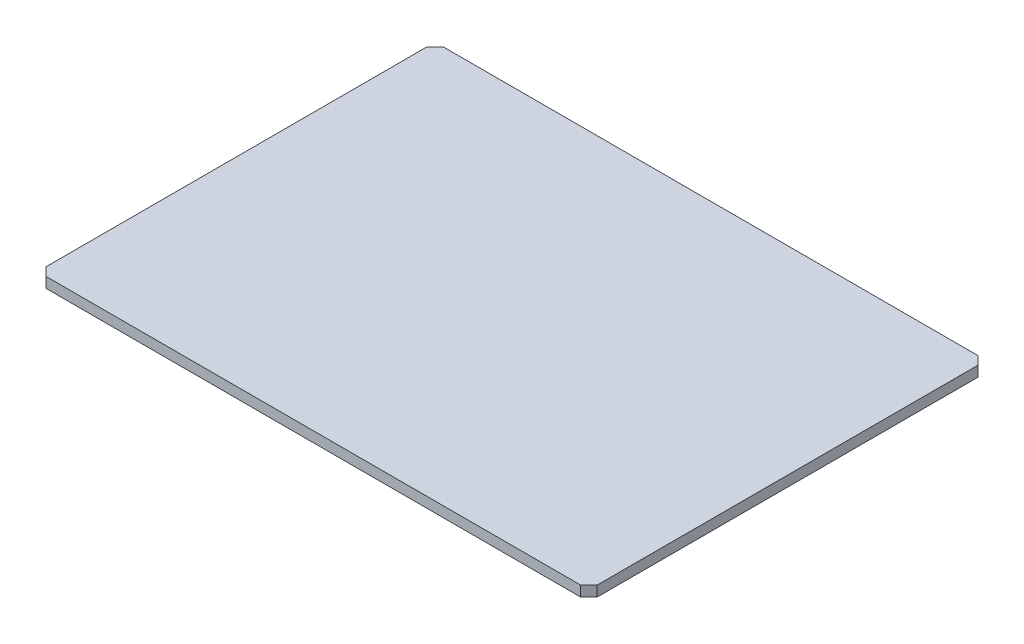
ISO-10303-21;
HEADER;
FILE_DESCRIPTION(('STEP AP214'),'2;1');
FILE_NAME('part.step','',(''),(''),'','','');
FILE_SCHEMA(('AUTOMOTIVE_DESIGN { 1 0 10303 214 1 1 1 1 }'));
ENDSEC;
DATA;
#1=APPLICATION_CONTEXT('core data for automotive mechanical design processes');
#2=APPLICATION_PROTOCOL_DEFINITION('international standard','automotive_design',2000,#1);
#3=PRODUCT_CONTEXT('',#1,'mechanical');
#4=PRODUCT('Part','Part','',(#3));
#5=PRODUCT_RELATED_PRODUCT_CATEGORY('part','',(#4));
#6=PRODUCT_DEFINITION_FORMATION('','',#4);
#7=PRODUCT_DEFINITION_CONTEXT('part definition',#1,'design');
#8=PRODUCT_DEFINITION('design','',#6,#7);
#9=PRODUCT_DEFINITION_SHAPE('','',#8);
#10=(LENGTH_UNIT() NAMED_UNIT(*) SI_UNIT(.MILLI.,.METRE.));
#11=(NAMED_UNIT(*) PLANE_ANGLE_UNIT() SI_UNIT($,.RADIAN.));
#12=(NAMED_UNIT(*) SI_UNIT($,.STERADIAN.) SOLID_ANGLE_UNIT());
#13=UNCERTAINTY_MEASURE_WITH_UNIT(LENGTH_MEASURE(1.E-05),#10,'distance_accuracy_value','');
#14=(GEOMETRIC_REPRESENTATION_CONTEXT(3) GLOBAL_UNCERTAINTY_ASSIGNED_CONTEXT((#13)) GLOBAL_UNIT_ASSIGNED_CONTEXT((#10,
#11,#12)) REPRESENTATION_CONTEXT('',''));
#15=CARTESIAN_POINT('',(0.,0.,0.));
#16=DIRECTION('',(0.,0.,1.));
#17=DIRECTION('',(1.,0.,0.));
#18=AXIS2_PLACEMENT_3D('',#15,#16,#17);
#19=CARTESIAN_POINT('',(0.,0.,0.));
#20=DIRECTION('',(0.,1.,0.));
#21=DIRECTION('',(0.,0.,1.));
#22=AXIS2_PLACEMENT_3D('',#19,#20,#21);
#23=PLANE('',#22);
#24=DIRECTION('',(1.,0.,0.));
#25=VECTOR('',#24,1.);
#26=CARTESIAN_POINT('',(-66.3,0.,8.67499999999998));
#27=LINE('',#26,#25);
#28=CARTESIAN_POINT('',(-66.3,0.,8.67499999999997));
#29=VERTEX_POINT('',#28);
#30=CARTESIAN_POINT('',(-58.425,0.,8.67499999999998));
#31=VERTEX_POINT('',#30);
#32=EDGE_CURVE('E148',#29,#31,#27,.T.);
#33=ORIENTED_EDGE('',*,*,#32,.F.);
#34=DIRECTION('',(0.,0.,1.));
#35=VECTOR('',#34,1.);
#36=CARTESIAN_POINT('',(-66.3,0.,-47.8));
#37=LINE('',#36,#35);
#38=CARTESIAN_POINT('',(-66.3,0.,-45.8));
#39=VERTEX_POINT('',#38);
#40=EDGE_CURVE('E177',#39,#29,#37,.T.);
#41=ORIENTED_EDGE('',*,*,#40,.F.);
#42=DIRECTION('',(-0.70710678118655,0.,0.707106781186545));
#43=VECTOR('',#42,1.);
#44=CARTESIAN_POINT('',(-66.3,0.,-45.8));
#45=LINE('',#44,#43);
#46=CARTESIAN_POINT('',(-64.3,0.,-47.8));
#47=VERTEX_POINT('',#46);
#48=EDGE_CURVE('E186',#39,#47,#45,.F.);
#49=ORIENTED_EDGE('',*,*,#48,.T.);
#50=DIRECTION('',(-1.,0.,0.));
#51=VECTOR('',#50,1.);
#52=CARTESIAN_POINT('',(-66.3,0.,-47.8));
#53=LINE('',#52,#51);
#54=CARTESIAN_POINT('',(64.3,0.,-47.8));
#55=VERTEX_POINT('',#54);
#56=EDGE_CURVE('E154',#55,#47,#53,.T.);
#57=ORIENTED_EDGE('',*,*,#56,.F.);
#58=DIRECTION('',(-0.707106781186548,0.,-0.707106781186548));
#59=VECTOR('',#58,1.);
#60=CARTESIAN_POINT('',(64.3,0.,-47.8));
#61=LINE('',#60,#59);
#62=CARTESIAN_POINT('',(66.3,0.,-45.8));
#63=VERTEX_POINT('',#62);
#64=EDGE_CURVE('E188',#55,#63,#61,.F.);
#65=ORIENTED_EDGE('',*,*,#64,.T.);
#66=DIRECTION('',(0.,0.,-1.));
#67=VECTOR('',#66,1.);
#68=CARTESIAN_POINT('',(66.3,0.,-47.8));
#69=LINE('',#68,#67);
#70=CARTESIAN_POINT('',(66.3,0.,45.8));
#71=VERTEX_POINT('',#70);
#72=EDGE_CURVE('E151',#71,#63,#69,.T.);
#73=ORIENTED_EDGE('',*,*,#72,.F.);
#74=DIRECTION('',(0.70710678118655,0.,-0.707106781186545));
#75=VECTOR('',#74,1.);
#76=CARTESIAN_POINT('',(66.3,0.,45.8));
#77=LINE('',#76,#75);
#78=CARTESIAN_POINT('',(64.3,0.,47.8));
#79=VERTEX_POINT('',#78);
#80=EDGE_CURVE('E193',#71,#79,#77,.F.);
#81=ORIENTED_EDGE('',*,*,#80,.T.);
#82=DIRECTION('',(1.,0.,0.));
#83=VECTOR('',#82,1.);
#84=CARTESIAN_POINT('',(-66.3,0.,47.8));
#85=LINE('',#84,#83);
#86=CARTESIAN_POINT('',(-64.3,0.,47.8));
#87=VERTEX_POINT('',#86);
#88=EDGE_CURVE('E164',#87,#79,#85,.T.);
#89=ORIENTED_EDGE('',*,*,#88,.F.);
#90=DIRECTION('',(0.707106781186545,0.,0.70710678118655));
#91=VECTOR('',#90,1.);
#92=CARTESIAN_POINT('',(-64.3,0.,47.8));
#93=LINE('',#92,#91);
#94=CARTESIAN_POINT('',(-66.3,0.,45.7999999999999));
#95=VERTEX_POINT('',#94);
#96=EDGE_CURVE('E190',#87,#95,#93,.F.);
#97=ORIENTED_EDGE('',*,*,#96,.T.);
#98=CARTESIAN_POINT('',(-66.3,0.,18.925));
#99=VERTEX_POINT('',#98);
#100=EDGE_CURVE('E176',#99,#95,#37,.T.);
#101=ORIENTED_EDGE('',*,*,#100,.F.);
#102=DIRECTION('',(-1.,0.,0.));
#103=VECTOR('',#102,1.);
#104=CARTESIAN_POINT('',(-58.425,0.,18.925));
#105=LINE('',#104,#103);
#106=CARTESIAN_POINT('',(-58.425,0.,18.925));
#107=VERTEX_POINT('',#106);
#108=EDGE_CURVE('E62',#107,#99,#105,.T.);
#109=ORIENTED_EDGE('',*,*,#108,.F.);
#110=CARTESIAN_POINT('',(-58.425,0.,13.8));
#111=DIRECTION('',(0.,-1.,0.));
#112=DIRECTION('',(0.,0.,1.));
#113=AXIS2_PLACEMENT_3D('',#110,#111,#112);
#114=CIRCLE('',#113,5.125);
#115=EDGE_CURVE('E57',#31,#107,#114,.T.);
#116=ORIENTED_EDGE('',*,*,#115,.F.);
#117=EDGE_LOOP('',(#33,#41,#49,#57,#65,#73,#81,#89,#97,#101,#109,#116));
#118=FACE_BOUND('',#117,.T.);
#119=ADVANCED_FACE('F41',(#118),#23,.F.);
#120=CARTESIAN_POINT('',(66.3,2.5,-47.8));
#121=DIRECTION('',(-1.,0.,0.));
#122=DIRECTION('',(0.,0.,1.));
#123=AXIS2_PLACEMENT_3D('',#120,#121,#122);
#124=PLANE('',#123);
#125=DIRECTION('',(0.,0.,-1.));
#126=VECTOR('',#125,1.);
#127=CARTESIAN_POINT('',(66.3,2.5,-47.8));
#128=LINE('',#127,#126);
#129=CARTESIAN_POINT('',(66.3,2.5,45.8));
#130=VERTEX_POINT('',#129);
#131=CARTESIAN_POINT('',(66.3,2.5,-45.8));
#132=VERTEX_POINT('',#131);
#133=EDGE_CURVE('E160',#130,#132,#128,.T.);
#134=ORIENTED_EDGE('',*,*,#133,.F.);
#135=DIRECTION('',(0.,-1.,0.));
#136=VECTOR('',#135,1.);
#137=CARTESIAN_POINT('',(66.3,2.5,45.8));
#138=LINE('',#137,#136);
#139=EDGE_CURVE('E183',#130,#71,#138,.T.);
#140=ORIENTED_EDGE('',*,*,#139,.T.);
#141=ORIENTED_EDGE('',*,*,#72,.T.);
#142=DIRECTION('',(0.,1.,0.));
#143=VECTOR('',#142,1.);
#144=CARTESIAN_POINT('',(66.3,2.5,-45.8));
#145=LINE('',#144,#143);
#146=EDGE_CURVE('E172',#63,#132,#145,.T.);
#147=ORIENTED_EDGE('',*,*,#146,.T.);
#148=EDGE_LOOP('',(#134,#140,#141,#147));
#149=FACE_BOUND('',#148,.T.);
#150=ADVANCED_FACE('F255',(#149),#124,.F.);
#151=CARTESIAN_POINT('',(-66.3,2.5,-47.8));
#152=DIRECTION('',(0.,0.,1.));
#153=DIRECTION('',(1.,0.,0.));
#154=AXIS2_PLACEMENT_3D('',#151,#152,#153);
#155=PLANE('',#154);
#156=DIRECTION('',(-1.,0.,0.));
#157=VECTOR('',#156,1.);
#158=CARTESIAN_POINT('',(-66.3,2.5,-47.8));
#159=LINE('',#158,#157);
#160=CARTESIAN_POINT('',(64.3,2.5,-47.8));
#161=VERTEX_POINT('',#160);
#162=CARTESIAN_POINT('',(-64.3,2.5,-47.8));
#163=VERTEX_POINT('',#162);
#164=EDGE_CURVE('E163',#161,#163,#159,.T.);
#165=ORIENTED_EDGE('',*,*,#164,.F.);
#166=DIRECTION('',(0.,-1.,0.));
#167=VECTOR('',#166,1.);
#168=CARTESIAN_POINT('',(64.3,2.5,-47.8));
#169=LINE('',#168,#167);
#170=EDGE_CURVE('E11',#161,#55,#169,.T.);
#171=ORIENTED_EDGE('',*,*,#170,.T.);
#172=ORIENTED_EDGE('',*,*,#56,.T.);
#173=DIRECTION('',(0.,1.,0.));
#174=VECTOR('',#173,1.);
#175=CARTESIAN_POINT('',(-64.3,2.5,-47.8));
#176=LINE('',#175,#174);
#177=EDGE_CURVE('E50',#47,#163,#176,.T.);
#178=ORIENTED_EDGE('',*,*,#177,.T.);
#179=EDGE_LOOP('',(#165,#171,#172,#178));
#180=FACE_BOUND('',#179,.T.);
#181=ADVANCED_FACE('F215',(#180),#155,.F.);
#182=CARTESIAN_POINT('',(-66.3,2.5,-47.8));
#183=DIRECTION('',(1.,0.,0.));
#184=DIRECTION('',(0.,0.,-1.));
#185=AXIS2_PLACEMENT_3D('',#182,#183,#184);
#186=PLANE('',#185);
#187=ORIENTED_EDGE('',*,*,#40,.T.);
#188=DIRECTION('',(0.,1.,0.));
#189=VECTOR('',#188,1.);
#190=CARTESIAN_POINT('',(-66.3,-1.3,8.67499999999998));
#191=LINE('',#190,#189);
#192=CARTESIAN_POINT('',(-66.3,-1.3,8.67499999999998));
#193=VERTEX_POINT('',#192);
#194=EDGE_CURVE('E156',#193,#29,#191,.T.);
#195=ORIENTED_EDGE('',*,*,#194,.F.);
#196=DIRECTION('',(0.,0.,-1.));
#197=VECTOR('',#196,1.);
#198=CARTESIAN_POINT('',(-66.3,-1.3,18.925));
#199=LINE('',#198,#197);
#200=CARTESIAN_POINT('',(-66.3,-1.3,18.925));
#201=VERTEX_POINT('',#200);
#202=EDGE_CURVE('E138',#201,#193,#199,.T.);
#203=ORIENTED_EDGE('',*,*,#202,.F.);
#204=DIRECTION('',(0.,1.,0.));
#205=VECTOR('',#204,1.);
#206=CARTESIAN_POINT('',(-66.3,-1.3,18.925));
#207=LINE('',#206,#205);
#208=EDGE_CURVE('E135',#201,#99,#207,.T.);
#209=ORIENTED_EDGE('',*,*,#208,.T.);
#210=ORIENTED_EDGE('',*,*,#100,.T.);
#211=DIRECTION('',(0.,1.,0.));
#212=VECTOR('',#211,1.);
#213=CARTESIAN_POINT('',(-66.3,2.5,45.8));
#214=LINE('',#213,#212);
#215=CARTESIAN_POINT('',(-66.3,2.5,45.7999999999999));
#216=VERTEX_POINT('',#215);
#217=EDGE_CURVE('E211',#95,#216,#214,.T.);
#218=ORIENTED_EDGE('',*,*,#217,.T.);
#219=DIRECTION('',(0.,0.,1.));
#220=VECTOR('',#219,1.);
#221=CARTESIAN_POINT('',(-66.3,2.5,-47.8));
#222=LINE('',#221,#220);
#223=CARTESIAN_POINT('',(-66.3,2.5,-45.8));
#224=VERTEX_POINT('',#223);
#225=EDGE_CURVE('E167',#224,#216,#222,.T.);
#226=ORIENTED_EDGE('',*,*,#225,.F.);
#227=DIRECTION('',(0.,-1.,0.));
#228=VECTOR('',#227,1.);
#229=CARTESIAN_POINT('',(-66.3,2.5,-45.8));
#230=LINE('',#229,#228);
#231=EDGE_CURVE('E208',#224,#39,#230,.T.);
#232=ORIENTED_EDGE('',*,*,#231,.T.);
#233=EDGE_LOOP('',(#187,#195,#203,#209,#210,#218,#226,#232));
#234=FACE_BOUND('',#233,.T.);
#235=ADVANCED_FACE('F227',(#234),#186,.F.);
#236=CARTESIAN_POINT('',(-66.3,2.5,47.8));
#237=DIRECTION('',(0.,0.,-1.));
#238=DIRECTION('',(-1.,0.,0.));
#239=AXIS2_PLACEMENT_3D('',#236,#237,#238);
#240=PLANE('',#239);
#241=ORIENTED_EDGE('',*,*,#88,.T.);
#242=DIRECTION('',(0.,1.,0.));
#243=VECTOR('',#242,1.);
#244=CARTESIAN_POINT('',(64.3,2.5,47.8));
#245=LINE('',#244,#243);
#246=CARTESIAN_POINT('',(64.3,2.5,47.8));
#247=VERTEX_POINT('',#246);
#248=EDGE_CURVE('E198',#79,#247,#245,.T.);
#249=ORIENTED_EDGE('',*,*,#248,.T.);
#250=DIRECTION('',(1.,0.,0.));
#251=VECTOR('',#250,1.);
#252=CARTESIAN_POINT('',(-66.3,2.5,47.8));
#253=LINE('',#252,#251);
#254=CARTESIAN_POINT('',(-64.3,2.5,47.8));
#255=VERTEX_POINT('',#254);
#256=EDGE_CURVE('E170',#255,#247,#253,.T.);
#257=ORIENTED_EDGE('',*,*,#256,.F.);
#258=DIRECTION('',(0.,-1.,0.));
#259=VECTOR('',#258,1.);
#260=CARTESIAN_POINT('',(-64.3,2.5,47.8));
#261=LINE('',#260,#259);
#262=EDGE_CURVE('E195',#255,#87,#261,.T.);
#263=ORIENTED_EDGE('',*,*,#262,.T.);
#264=EDGE_LOOP('',(#241,#249,#257,#263));
#265=FACE_BOUND('',#264,.T.);
#266=ADVANCED_FACE('F248',(#265),#240,.F.);
#267=CARTESIAN_POINT('',(0.,2.5,0.));
#268=DIRECTION('',(0.,1.,0.));
#269=DIRECTION('',(0.,0.,1.));
#270=AXIS2_PLACEMENT_3D('',#267,#268,#269);
#271=PLANE('',#270);
#272=ORIENTED_EDGE('',*,*,#256,.T.);
#273=DIRECTION('',(-0.70710678118655,0.,0.707106781186545));
#274=VECTOR('',#273,1.);
#275=CARTESIAN_POINT('',(56.0499999999998,2.5,56.0500000000001));
#276=LINE('',#275,#274);
#277=EDGE_CURVE('E206',#247,#130,#276,.F.);
#278=ORIENTED_EDGE('',*,*,#277,.T.);
#279=ORIENTED_EDGE('',*,*,#133,.T.);
#280=DIRECTION('',(0.707106781186548,0.,0.707106781186548));
#281=VECTOR('',#280,1.);
#282=CARTESIAN_POINT('',(56.05,2.5,-56.05));
#283=LINE('',#282,#281);
#284=EDGE_CURVE('E202',#132,#161,#283,.F.);
#285=ORIENTED_EDGE('',*,*,#284,.T.);
#286=ORIENTED_EDGE('',*,*,#164,.T.);
#287=DIRECTION('',(0.70710678118655,0.,-0.707106781186545));
#288=VECTOR('',#287,1.);
#289=CARTESIAN_POINT('',(-56.0499999999998,2.5,-56.0500000000002));
#290=LINE('',#289,#288);
#291=EDGE_CURVE('E200',#163,#224,#290,.F.);
#292=ORIENTED_EDGE('',*,*,#291,.T.);
#293=ORIENTED_EDGE('',*,*,#225,.T.);
#294=DIRECTION('',(-0.707106781186545,0.,-0.70710678118655));
#295=VECTOR('',#294,1.);
#296=CARTESIAN_POINT('',(-56.0500000000002,2.5,56.0499999999998));
#297=LINE('',#296,#295);
#298=EDGE_CURVE('E204',#216,#255,#297,.F.);
#299=ORIENTED_EDGE('',*,*,#298,.T.);
#300=EDGE_LOOP('',(#272,#278,#279,#285,#286,#292,#293,#299));
#301=FACE_BOUND('',#300,.T.);
#302=ADVANCED_FACE('F221',(#301),#271,.T.);
#303=CARTESIAN_POINT('',(66.3,2.5,45.8));
#304=DIRECTION('',(-0.707106781186545,0.,-0.70710678118655));
#305=DIRECTION('',(0.,-1.,0.));
#306=AXIS2_PLACEMENT_3D('',#303,#304,#305);
#307=PLANE('',#306);
#308=ORIENTED_EDGE('',*,*,#277,.F.);
#309=ORIENTED_EDGE('',*,*,#248,.F.);
#310=ORIENTED_EDGE('',*,*,#80,.F.);
#311=ORIENTED_EDGE('',*,*,#139,.F.);
#312=EDGE_LOOP('',(#308,#309,#310,#311));
#313=FACE_BOUND('',#312,.T.);
#314=ADVANCED_FACE('F251',(#313),#307,.F.);
#315=CARTESIAN_POINT('',(-64.3,2.5,47.8));
#316=DIRECTION('',(0.70710678118655,0.,-0.707106781186545));
#317=DIRECTION('',(0.,-1.,0.));
#318=AXIS2_PLACEMENT_3D('',#315,#316,#317);
#319=PLANE('',#318);
#320=ORIENTED_EDGE('',*,*,#298,.F.);
#321=ORIENTED_EDGE('',*,*,#217,.F.);
#322=ORIENTED_EDGE('',*,*,#96,.F.);
#323=ORIENTED_EDGE('',*,*,#262,.F.);
#324=EDGE_LOOP('',(#320,#321,#322,#323));
#325=FACE_BOUND('',#324,.T.);
#326=ADVANCED_FACE('F244',(#325),#319,.F.);
#327=CARTESIAN_POINT('',(64.3,2.5,-47.8));
#328=DIRECTION('',(-0.707106781186547,0.,0.707106781186547));
#329=DIRECTION('',(0.,-1.,0.));
#330=AXIS2_PLACEMENT_3D('',#327,#328,#329);
#331=PLANE('',#330);
#332=ORIENTED_EDGE('',*,*,#284,.F.);
#333=ORIENTED_EDGE('',*,*,#146,.F.);
#334=ORIENTED_EDGE('',*,*,#64,.F.);
#335=ORIENTED_EDGE('',*,*,#170,.F.);
#336=EDGE_LOOP('',(#332,#333,#334,#335));
#337=FACE_BOUND('',#336,.T.);
#338=ADVANCED_FACE('F259',(#337),#331,.F.);
#339=CARTESIAN_POINT('',(-66.3,2.5,-45.8));
#340=DIRECTION('',(0.707106781186545,0.,0.70710678118655));
#341=DIRECTION('',(0.,-1.,0.));
#342=AXIS2_PLACEMENT_3D('',#339,#340,#341);
#343=PLANE('',#342);
#344=ORIENTED_EDGE('',*,*,#291,.F.);
#345=ORIENTED_EDGE('',*,*,#177,.F.);
#346=ORIENTED_EDGE('',*,*,#48,.F.);
#347=ORIENTED_EDGE('',*,*,#231,.F.);
#348=EDGE_LOOP('',(#344,#345,#346,#347));
#349=FACE_BOUND('',#348,.T.);
#350=ADVANCED_FACE('F44',(#349),#343,.F.);
#351=CARTESIAN_POINT('',(-58.425,-1.3,13.8));
#352=DIRECTION('',(0.,1.,0.));
#353=DIRECTION('',(0.,0.,1.));
#354=AXIS2_PLACEMENT_3D('',#351,#352,#353);
#355=CYLINDRICAL_SURFACE('',#354,5.125);
#356=ORIENTED_EDGE('',*,*,#115,.T.);
#357=DIRECTION('',(0.,1.,0.));
#358=VECTOR('',#357,1.);
#359=CARTESIAN_POINT('',(-58.425,-1.3,18.925));
#360=LINE('',#359,#358);
#361=CARTESIAN_POINT('',(-58.425,-1.3,18.925));
#362=VERTEX_POINT('',#361);
#363=EDGE_CURVE('E133',#362,#107,#360,.T.);
#364=ORIENTED_EDGE('',*,*,#363,.F.);
#365=CARTESIAN_POINT('',(-58.425,-1.3,13.8));
#366=DIRECTION('',(0.,-1.,0.));
#367=DIRECTION('',(0.,0.,1.));
#368=AXIS2_PLACEMENT_3D('',#365,#366,#367);
#369=CIRCLE('',#368,5.125);
#370=CARTESIAN_POINT('',(-58.425,-1.3,8.67499999999998));
#371=VERTEX_POINT('',#370);
#372=EDGE_CURVE('E139',#371,#362,#369,.T.);
#373=ORIENTED_EDGE('',*,*,#372,.F.);
#374=DIRECTION('',(0.,1.,0.));
#375=VECTOR('',#374,1.);
#376=CARTESIAN_POINT('',(-58.425,-1.3,8.67499999999998));
#377=LINE('',#376,#375);
#378=EDGE_CURVE('E235',#371,#31,#377,.T.);
#379=ORIENTED_EDGE('',*,*,#378,.T.);
#380=EDGE_LOOP('',(#356,#364,#373,#379));
#381=FACE_BOUND('',#380,.T.);
#382=ADVANCED_FACE('F150',(#381),#355,.T.);
#383=CARTESIAN_POINT('',(-58.425,-1.3,18.925));
#384=DIRECTION('',(0.,0.,-1.));
#385=DIRECTION('',(-1.,0.,0.));
#386=AXIS2_PLACEMENT_3D('',#383,#384,#385);
#387=PLANE('',#386);
#388=ORIENTED_EDGE('',*,*,#108,.T.);
#389=ORIENTED_EDGE('',*,*,#208,.F.);
#390=DIRECTION('',(-1.,0.,0.));
#391=VECTOR('',#390,1.);
#392=CARTESIAN_POINT('',(-58.425,-1.3,18.925));
#393=LINE('',#392,#391);
#394=EDGE_CURVE('E129',#362,#201,#393,.T.);
#395=ORIENTED_EDGE('',*,*,#394,.F.);
#396=ORIENTED_EDGE('',*,*,#363,.T.);
#397=EDGE_LOOP('',(#388,#389,#395,#396));
#398=FACE_BOUND('',#397,.T.);
#399=ADVANCED_FACE('F131',(#398),#387,.F.);
#400=CARTESIAN_POINT('',(-66.3,-1.3,8.67499999999998));
#401=DIRECTION('',(0.,0.,1.));
#402=DIRECTION('',(1.,0.,0.));
#403=AXIS2_PLACEMENT_3D('',#400,#401,#402);
#404=PLANE('',#403);
#405=ORIENTED_EDGE('',*,*,#32,.T.);
#406=ORIENTED_EDGE('',*,*,#378,.F.);
#407=DIRECTION('',(1.,0.,0.));
#408=VECTOR('',#407,1.);
#409=CARTESIAN_POINT('',(-66.3,-1.3,8.67499999999998));
#410=LINE('',#409,#408);
#411=EDGE_CURVE('E144',#193,#371,#410,.T.);
#412=ORIENTED_EDGE('',*,*,#411,.F.);
#413=ORIENTED_EDGE('',*,*,#194,.T.);
#414=EDGE_LOOP('',(#405,#406,#412,#413));
#415=FACE_BOUND('',#414,.T.);
#416=ADVANCED_FACE('F236',(#415),#404,.F.);
#417=CARTESIAN_POINT('',(-58.425,-1.3,13.8));
#418=DIRECTION('',(0.,1.,0.));
#419=DIRECTION('',(0.,0.,1.));
#420=AXIS2_PLACEMENT_3D('',#417,#418,#419);
#421=PLANE('',#420);
#422=ORIENTED_EDGE('',*,*,#372,.T.);
#423=ORIENTED_EDGE('',*,*,#394,.T.);
#424=ORIENTED_EDGE('',*,*,#202,.T.);
#425=ORIENTED_EDGE('',*,*,#411,.T.);
#426=EDGE_LOOP('',(#422,#423,#424,#425));
#427=FACE_BOUND('',#426,.T.);
#428=ADVANCED_FACE('F142',(#427),#421,.F.);
#429=CLOSED_SHELL('',(#119,#150,#181,#235,#266,#302,#314,#326,#338,#350,#382,#399,#416,#428));
#430=MANIFOLD_SOLID_BREP('B2',#429);
#431=ADVANCED_BREP_SHAPE_REPRESENTATION('',(#18,#430),#14);
#432=SHAPE_DEFINITION_REPRESENTATION(#9,#431);
ENDSEC;
END-ISO-10303-21;
